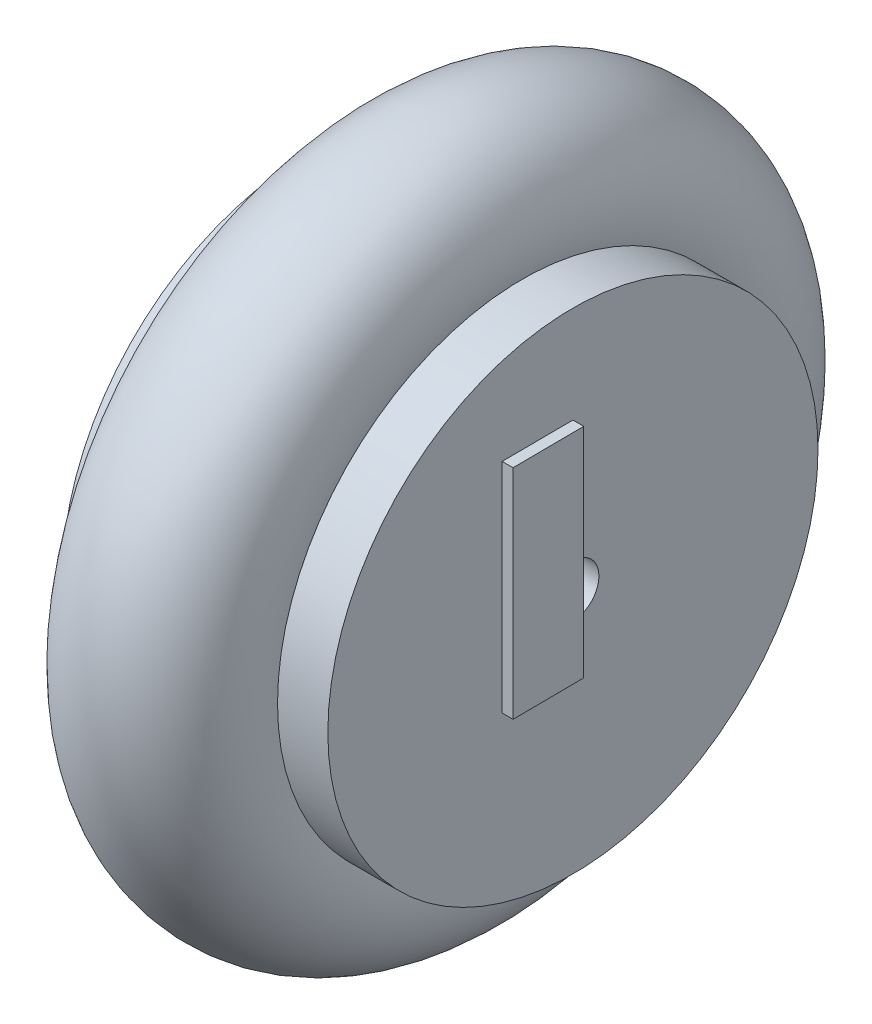
ISO-10303-21;
HEADER;
FILE_DESCRIPTION(('STEP AP214'),'2;1');
FILE_NAME('part.step','',(''),(''),'','','');
FILE_SCHEMA(('AUTOMOTIVE_DESIGN { 1 0 10303 214 1 1 1 1 }'));
ENDSEC;
DATA;
#1=APPLICATION_CONTEXT('core data for automotive mechanical design processes');
#2=APPLICATION_PROTOCOL_DEFINITION('international standard','automotive_design',2000,#1);
#3=PRODUCT_CONTEXT('',#1,'mechanical');
#4=PRODUCT('Part','Part','',(#3));
#5=PRODUCT_RELATED_PRODUCT_CATEGORY('part','',(#4));
#6=PRODUCT_DEFINITION_FORMATION('','',#4);
#7=PRODUCT_DEFINITION_CONTEXT('part definition',#1,'design');
#8=PRODUCT_DEFINITION('design','',#6,#7);
#9=PRODUCT_DEFINITION_SHAPE('','',#8);
#10=(LENGTH_UNIT() NAMED_UNIT(*) SI_UNIT(.MILLI.,.METRE.));
#11=(NAMED_UNIT(*) PLANE_ANGLE_UNIT() SI_UNIT($,.RADIAN.));
#12=(NAMED_UNIT(*) SI_UNIT($,.STERADIAN.) SOLID_ANGLE_UNIT());
#13=UNCERTAINTY_MEASURE_WITH_UNIT(LENGTH_MEASURE(1.E-05),#10,'distance_accuracy_value','');
#14=(GEOMETRIC_REPRESENTATION_CONTEXT(3) GLOBAL_UNCERTAINTY_ASSIGNED_CONTEXT((#13)) GLOBAL_UNIT_ASSIGNED_CONTEXT((#10,
#11,#12)) REPRESENTATION_CONTEXT('',''));
#15=CARTESIAN_POINT('',(0.,0.,0.));
#16=DIRECTION('',(0.,0.,1.));
#17=DIRECTION('',(1.,0.,0.));
#18=AXIS2_PLACEMENT_3D('',#15,#16,#17);
#19=CARTESIAN_POINT('',(0.,0.,0.));
#20=DIRECTION('',(1.,0.,0.));
#21=DIRECTION('',(0.,0.,-1.));
#22=AXIS2_PLACEMENT_3D('',#19,#20,#21);
#23=TOROIDAL_SURFACE('',#22,22.6899260605056,7.62);
#24=CARTESIAN_POINT('',(-7.44659608321137,0.,0.));
#25=DIRECTION('',(1.,0.,0.));
#26=DIRECTION('',(0.,0.,-1.));
#27=AXIS2_PLACEMENT_3D('',#24,#25,#26);
#28=CIRCLE('',#27,21.0735700435647);
#29=CARTESIAN_POINT('',(-7.44659608321137,0.,-21.0735700435647));
#30=VERTEX_POINT('',#29);
#31=EDGE_CURVE('E183',#30,#30,#28,.F.);
#32=ORIENTED_EDGE('',*,*,#31,.F.);
#33=CARTESIAN_POINT('',(0.,0.,-22.6899260605056));
#34=DIRECTION('',(0.,1.,0.));
#35=DIRECTION('',(0.,0.,1.));
#36=AXIS2_PLACEMENT_3D('',#33,#34,#35);
#37=CIRCLE('',#36,7.62);
#38=CARTESIAN_POINT('',(7.44659608321137,0.,-21.0735700435647));
#39=VERTEX_POINT('',#38);
#40=EDGE_CURVE('E181',#39,#30,#37,.T.);
#41=ORIENTED_EDGE('',*,*,#40,.F.);
#42=CARTESIAN_POINT('',(7.44659608321137,0.,0.));
#43=DIRECTION('',(-1.,0.,0.));
#44=DIRECTION('',(0.,0.,1.));
#45=AXIS2_PLACEMENT_3D('',#42,#43,#44);
#46=CIRCLE('',#45,21.0735700435647);
#47=EDGE_CURVE('E13',#39,#39,#46,.F.);
#48=ORIENTED_EDGE('',*,*,#47,.F.);
#49=ORIENTED_EDGE('',*,*,#40,.T.);
#50=EDGE_LOOP('',(#32,#41,#48,#49));
#51=FACE_BOUND('',#50,.T.);
#52=ADVANCED_FACE('F165',(#51),#23,.T.);
#53=CARTESIAN_POINT('',(-11.08752571471,2.23482823140527,0.));
#54=DIRECTION('',(1.,0.,0.));
#55=DIRECTION('',(0.,0.,-1.));
#56=AXIS2_PLACEMENT_3D('',#53,#54,#55);
#57=PLANE('',#56);
#58=CARTESIAN_POINT('',(-11.08752571471,0.,0.));
#59=DIRECTION('',(-1.,0.,0.));
#60=DIRECTION('',(0.,0.,1.));
#61=AXIS2_PLACEMENT_3D('',#58,#59,#60);
#62=CIRCLE('',#61,2.23482823140527);
#63=CARTESIAN_POINT('',(-11.08752571471,0.,2.23482823140527));
#64=VERTEX_POINT('',#63);
#65=EDGE_CURVE('E187',#64,#64,#62,.T.);
#66=ORIENTED_EDGE('',*,*,#65,.F.);
#67=EDGE_LOOP('',(#66));
#68=FACE_BOUND('',#67,.T.);
#69=CARTESIAN_POINT('',(-11.08752571471,0.,0.));
#70=DIRECTION('',(-1.,0.,0.));
#71=DIRECTION('',(0.,0.,1.));
#72=AXIS2_PLACEMENT_3D('',#69,#70,#71);
#73=CIRCLE('',#72,21.0735700435647);
#74=CARTESIAN_POINT('',(-11.08752571471,0.,21.0735700435647));
#75=VERTEX_POINT('',#74);
#76=EDGE_CURVE('E174',#75,#75,#73,.T.);
#77=ORIENTED_EDGE('',*,*,#76,.T.);
#78=EDGE_LOOP('',(#77));
#79=FACE_BOUND('',#78,.T.);
#80=ADVANCED_FACE('F167',(#68,#79),#57,.F.);
#81=CARTESIAN_POINT('',(-11.08752571471,0.,0.));
#82=DIRECTION('',(-1.,0.,0.));
#83=DIRECTION('',(0.,0.,1.));
#84=AXIS2_PLACEMENT_3D('',#81,#82,#83);
#85=CYLINDRICAL_SURFACE('',#84,21.0735700435647);
#86=ORIENTED_EDGE('',*,*,#31,.T.);
#87=EDGE_LOOP('',(#86));
#88=FACE_BOUND('',#87,.T.);
#89=ORIENTED_EDGE('',*,*,#76,.F.);
#90=EDGE_LOOP('',(#89));
#91=FACE_BOUND('',#90,.T.);
#92=ADVANCED_FACE('F205',(#88,#91),#85,.T.);
#93=CARTESIAN_POINT('',(-11.08752571471,0.,0.));
#94=DIRECTION('',(-1.,0.,0.));
#95=DIRECTION('',(0.,0.,1.));
#96=AXIS2_PLACEMENT_3D('',#93,#94,#95);
#97=CYLINDRICAL_SURFACE('',#96,21.0735700435647);
#98=ORIENTED_EDGE('',*,*,#47,.T.);
#99=EDGE_LOOP('',(#98));
#100=FACE_BOUND('',#99,.T.);
#101=CARTESIAN_POINT('',(11.77247428529,0.,0.));
#102=DIRECTION('',(-1.,0.,0.));
#103=DIRECTION('',(0.,0.,1.));
#104=AXIS2_PLACEMENT_3D('',#101,#102,#103);
#105=CIRCLE('',#104,21.0735700435647);
#106=CARTESIAN_POINT('',(11.77247428529,0.,21.0735700435647));
#107=VERTEX_POINT('',#106);
#108=EDGE_CURVE('E197',#107,#107,#105,.T.);
#109=ORIENTED_EDGE('',*,*,#108,.T.);
#110=EDGE_LOOP('',(#109));
#111=FACE_BOUND('',#110,.T.);
#112=ADVANCED_FACE('F207',(#100,#111),#97,.T.);
#113=CARTESIAN_POINT('',(11.77247428529,21.0735700435647,0.));
#114=DIRECTION('',(-1.,0.,0.));
#115=DIRECTION('',(0.,0.,1.));
#116=AXIS2_PLACEMENT_3D('',#113,#114,#115);
#117=PLANE('',#116);
#118=ORIENTED_EDGE('',*,*,#108,.F.);
#119=EDGE_LOOP('',(#118));
#120=FACE_BOUND('',#119,.T.);
#121=CARTESIAN_POINT('',(11.77247428529,0.,0.));
#122=DIRECTION('',(-1.,0.,0.));
#123=DIRECTION('',(0.,0.,1.));
#124=AXIS2_PLACEMENT_3D('',#121,#122,#123);
#125=CIRCLE('',#124,2.23482823140527);
#126=CARTESIAN_POINT('',(11.77247428529,0.,2.23482823140527));
#127=VERTEX_POINT('',#126);
#128=EDGE_CURVE('E193',#127,#127,#125,.T.);
#129=ORIENTED_EDGE('',*,*,#128,.T.);
#130=EDGE_LOOP('',(#129));
#131=FACE_BOUND('',#130,.T.);
#132=ADVANCED_FACE('F213',(#120,#131),#117,.F.);
#133=CARTESIAN_POINT('',(-11.08752571471,0.,0.));
#134=DIRECTION('',(-1.,0.,0.));
#135=DIRECTION('',(0.,0.,1.));
#136=AXIS2_PLACEMENT_3D('',#133,#134,#135);
#137=CYLINDRICAL_SURFACE('',#136,2.23482823140527);
#138=ORIENTED_EDGE('',*,*,#128,.F.);
#139=EDGE_LOOP('',(#138));
#140=FACE_BOUND('',#139,.T.);
#141=ORIENTED_EDGE('',*,*,#65,.T.);
#142=EDGE_LOOP('',(#141));
#143=FACE_BOUND('',#142,.T.);
#144=ADVANCED_FACE('F222',(#140,#143),#137,.F.);
#145=CLOSED_SHELL('',(#52,#80,#92,#112,#132,#144));
#146=MANIFOLD_SOLID_BREP('B2',#145);
#147=CARTESIAN_POINT('',(-10.16,12.1755766306336,0.));
#148=DIRECTION('',(-0.999997904582266,0.,0.00204715194287313));
#149=DIRECTION('',(0.,-1.,0.));
#150=AXIS2_PLACEMENT_3D('',#147,#148,#149);
#151=PLANE('',#150);
#152=DIRECTION('',(0.,-1.,0.));
#153=VECTOR('',#152,1.);
#154=CARTESIAN_POINT('',(-10.16,3.08513875554073,0.));
#155=LINE('',#154,#153);
#156=CARTESIAN_POINT('',(-10.16,12.1755766306336,0.));
#157=VERTEX_POINT('',#156);
#158=CARTESIAN_POINT('',(-10.16,-6.0052991195521,0.));
#159=VERTEX_POINT('',#158);
#160=EDGE_CURVE('E163',#157,#159,#155,.T.);
#161=ORIENTED_EDGE('',*,*,#160,.T.);
#162=DIRECTION('',(0.00204711777716626,-0.00577741186013735,0.999981215234069));
#163=VECTOR('',#162,1.);
#164=CARTESIAN_POINT('',(-10.1537727317824,-6.02287382563787,3.04191156429276));
#165=LINE('',#164,#163);
#166=CARTESIAN_POINT('',(-10.1475454635648,-6.04044853172365,6.08382312858548));
#167=VERTEX_POINT('',#166);
#168=EDGE_CURVE('E279',#159,#167,#165,.T.);
#169=ORIENTED_EDGE('',*,*,#168,.T.);
#170=DIRECTION('',(0.,-1.,0.));
#171=VECTOR('',#170,1.);
#172=CARTESIAN_POINT('',(-10.1475454635648,3.04998934336919,6.08382312858548));
#173=LINE('',#172,#171);
#174=CARTESIAN_POINT('',(-10.1475454635648,12.140427218462,6.08382312858548));
#175=VERTEX_POINT('',#174);
#176=EDGE_CURVE('E367',#175,#167,#173,.T.);
#177=ORIENTED_EDGE('',*,*,#176,.F.);
#178=DIRECTION('',(0.00204711777716996,-0.00577741186013746,0.999981215234069));
#179=VECTOR('',#178,1.);
#180=CARTESIAN_POINT('',(-10.1537727317824,12.1580019245478,3.04191156429274));
#181=LINE('',#180,#179);
#182=EDGE_CURVE('E364',#157,#175,#181,.T.);
#183=ORIENTED_EDGE('',*,*,#182,.F.);
#184=EDGE_LOOP('',(#161,#169,#177,#183));
#185=FACE_BOUND('',#184,.T.);
#186=ADVANCED_FACE('F269',(#185),#151,.T.);
#187=CARTESIAN_POINT('',(-10.16,-6.0052991195521,0.));
#188=DIRECTION('',(0.,-0.99998331054689,-0.0057774239658499));
#189=DIRECTION('',(1.,0.,0.));
#190=AXIS2_PLACEMENT_3D('',#187,#188,#189);
#191=PLANE('',#190);
#192=DIRECTION('',(1.,0.,0.));
#193=VECTOR('',#192,1.);
#194=CARTESIAN_POINT('',(1.27000000000001,-6.0052991195521,0.));
#195=LINE('',#194,#193);
#196=CARTESIAN_POINT('',(12.7,-6.0052991195521,0.));
#197=VERTEX_POINT('',#196);
#198=EDGE_CURVE('E288',#159,#197,#195,.T.);
#199=ORIENTED_EDGE('',*,*,#198,.T.);
#200=DIRECTION('',(0.0020471177771674,-0.00577741186013749,0.999981215234069));
#201=VECTOR('',#200,1.);
#202=CARTESIAN_POINT('',(12.7062272682176,-6.02287382563787,3.04191156429276));
#203=LINE('',#202,#201);
#204=CARTESIAN_POINT('',(12.7124545364352,-6.04044853172365,6.08382312858548));
#205=VERTEX_POINT('',#204);
#206=EDGE_CURVE('E406',#197,#205,#203,.T.);
#207=ORIENTED_EDGE('',*,*,#206,.T.);
#208=DIRECTION('',(1.,0.,0.));
#209=VECTOR('',#208,1.);
#210=CARTESIAN_POINT('',(1.28245453643522,-6.04044853172365,6.08382312858548));
#211=LINE('',#210,#209);
#212=EDGE_CURVE('E369',#167,#205,#211,.T.);
#213=ORIENTED_EDGE('',*,*,#212,.F.);
#214=ORIENTED_EDGE('',*,*,#168,.F.);
#215=EDGE_LOOP('',(#199,#207,#213,#214));
#216=FACE_BOUND('',#215,.T.);
#217=ADVANCED_FACE('F415',(#216),#191,.T.);
#218=CARTESIAN_POINT('',(12.7,-6.0052991195521,0.));
#219=DIRECTION('',(0.999997904582266,0.,-0.00204715194287058));
#220=DIRECTION('',(0.,1.,0.));
#221=AXIS2_PLACEMENT_3D('',#218,#219,#220);
#222=PLANE('',#221);
#223=DIRECTION('',(0.,1.,0.));
#224=VECTOR('',#223,1.);
#225=CARTESIAN_POINT('',(12.7,3.36254409544794,0.));
#226=LINE('',#225,#224);
#227=CARTESIAN_POINT('',(12.7,12.730387310448,0.));
#228=VERTEX_POINT('',#227);
#229=EDGE_CURVE('E411',#197,#228,#226,.T.);
#230=ORIENTED_EDGE('',*,*,#229,.T.);
#231=DIRECTION('',(0.00204711777716769,-0.00577741186013749,0.999981215234069));
#232=VECTOR('',#231,1.);
#233=CARTESIAN_POINT('',(12.7062272682176,12.7128126043622,3.04191156429272));
#234=LINE('',#233,#232);
#235=CARTESIAN_POINT('',(12.7124545364352,12.6952378982764,6.08382312858545));
#236=VERTEX_POINT('',#235);
#237=EDGE_CURVE('E390',#228,#236,#234,.T.);
#238=ORIENTED_EDGE('',*,*,#237,.T.);
#239=DIRECTION('',(0.,1.,0.));
#240=VECTOR('',#239,1.);
#241=CARTESIAN_POINT('',(12.7124545364352,3.32739468327639,6.08382312858546));
#242=LINE('',#241,#240);
#243=EDGE_CURVE('E372',#205,#236,#242,.T.);
#244=ORIENTED_EDGE('',*,*,#243,.F.);
#245=ORIENTED_EDGE('',*,*,#206,.F.);
#246=EDGE_LOOP('',(#230,#238,#244,#245));
#247=FACE_BOUND('',#246,.T.);
#248=ADVANCED_FACE('F413',(#247),#222,.T.);
#249=CARTESIAN_POINT('',(12.7,12.730387310448,0.));
#250=DIRECTION('',(0.,0.99998331054689,0.00577742396585004));
#251=DIRECTION('',(-1.,0.,0.));
#252=AXIS2_PLACEMENT_3D('',#249,#250,#251);
#253=PLANE('',#252);
#254=DIRECTION('',(-1.,0.,0.));
#255=VECTOR('',#254,1.);
#256=CARTESIAN_POINT('',(10.16,12.730387310448,0.));
#257=LINE('',#256,#255);
#258=CARTESIAN_POINT('',(7.62,12.730387310448,0.));
#259=VERTEX_POINT('',#258);
#260=EDGE_CURVE('E385',#228,#259,#257,.T.);
#261=ORIENTED_EDGE('',*,*,#260,.T.);
#262=DIRECTION('',(0.00204711777717581,-0.00577741186013777,0.999981215234069));
#263=VECTOR('',#262,1.);
#264=CARTESIAN_POINT('',(7.62622726821763,12.7128126043622,3.04191156429272));
#265=LINE('',#264,#263);
#266=CARTESIAN_POINT('',(7.63245453643527,12.6952378982764,6.08382312858545));
#267=VERTEX_POINT('',#266);
#268=EDGE_CURVE('E383',#259,#267,#265,.T.);
#269=ORIENTED_EDGE('',*,*,#268,.T.);
#270=DIRECTION('',(-1.,0.,0.));
#271=VECTOR('',#270,1.);
#272=CARTESIAN_POINT('',(10.1724545364352,12.6952378982764,6.08382312858545));
#273=LINE('',#272,#271);
#274=EDGE_CURVE('E375',#236,#267,#273,.T.);
#275=ORIENTED_EDGE('',*,*,#274,.F.);
#276=ORIENTED_EDGE('',*,*,#237,.F.);
#277=EDGE_LOOP('',(#261,#269,#275,#276));
#278=FACE_BOUND('',#277,.T.);
#279=ADVANCED_FACE('F384',(#278),#253,.T.);
#280=CARTESIAN_POINT('',(7.62,12.730387310448,0.));
#281=DIRECTION('',(-0.928774578929489,0.370623041224326,0.0040426288453619));
#282=DIRECTION('',(-0.370626069779458,-0.928782168433391,0.));
#283=AXIS2_PLACEMENT_3D('',#280,#281,#282);
#284=PLANE('',#283);
#285=DIRECTION('',(-0.370626069779458,-0.928782168433391,0.));
#286=VECTOR('',#285,1.);
#287=CARTESIAN_POINT('',(5.08,6.36519365522399,0.));
#288=LINE('',#287,#286);
#289=CARTESIAN_POINT('',(2.54,0.,0.));
#290=VERTEX_POINT('',#289);
#291=EDGE_CURVE('E388',#259,#290,#288,.T.);
#292=ORIENTED_EDGE('',*,*,#291,.T.);
#293=DIRECTION('',(0.00204711777717602,-0.00577741186013738,0.999981215234069));
#294=VECTOR('',#293,1.);
#295=CARTESIAN_POINT('',(2.54622726821764,-0.0175747060857741,3.04191156429278));
#296=LINE('',#295,#294);
#297=CARTESIAN_POINT('',(2.55245453643527,-0.0351494121715481,6.08382312858552));
#298=VERTEX_POINT('',#297);
#299=EDGE_CURVE('E355',#290,#298,#296,.T.);
#300=ORIENTED_EDGE('',*,*,#299,.T.);
#301=DIRECTION('',(-0.370626069779458,-0.928782168433391,0.));
#302=VECTOR('',#301,1.);
#303=CARTESIAN_POINT('',(5.09245453643527,6.33004424305244,6.08382312858548));
#304=LINE('',#303,#302);
#305=EDGE_CURVE('E345',#267,#298,#304,.T.);
#306=ORIENTED_EDGE('',*,*,#305,.F.);
#307=ORIENTED_EDGE('',*,*,#268,.F.);
#308=EDGE_LOOP('',(#292,#300,#306,#307));
#309=FACE_BOUND('',#308,.T.);
#310=ADVANCED_FACE('F394',(#309),#284,.T.);
#311=CARTESIAN_POINT('',(2.54,0.,0.));
#312=DIRECTION('',(0.,0.99998331054689,0.00577742396584993));
#313=DIRECTION('',(-1.,0.,0.));
#314=AXIS2_PLACEMENT_3D('',#311,#312,#313);
#315=PLANE('',#314);
#316=DIRECTION('',(-1.,0.,0.));
#317=VECTOR('',#316,1.);
#318=CARTESIAN_POINT('',(1.27,0.,0.));
#319=LINE('',#318,#317);
#320=CARTESIAN_POINT('',(0.,0.,0.));
#321=VERTEX_POINT('',#320);
#322=EDGE_CURVE('E352',#290,#321,#319,.T.);
#323=ORIENTED_EDGE('',*,*,#322,.T.);
#324=DIRECTION('',(0.00204711777716154,-0.00577741186013746,0.999981215234069));
#325=VECTOR('',#324,1.);
#326=CARTESIAN_POINT('',(0.00622726821759368,-0.017574706085776,3.04191156429278));
#327=LINE('',#326,#325);
#328=CARTESIAN_POINT('',(0.0124545364351865,-0.0351494121715503,6.08382312858552));
#329=VERTEX_POINT('',#328);
#330=EDGE_CURVE('E336',#321,#329,#327,.T.);
#331=ORIENTED_EDGE('',*,*,#330,.T.);
#332=DIRECTION('',(-1.,0.,0.));
#333=VECTOR('',#332,1.);
#334=CARTESIAN_POINT('',(1.28245453643523,-0.0351494121715487,6.08382312858552));
#335=LINE('',#334,#333);
#336=EDGE_CURVE('E340',#298,#329,#335,.T.);
#337=ORIENTED_EDGE('',*,*,#336,.F.);
#338=ORIENTED_EDGE('',*,*,#299,.F.);
#339=EDGE_LOOP('',(#323,#331,#337,#338));
#340=FACE_BOUND('',#339,.T.);
#341=ADVANCED_FACE('F351',(#340),#315,.T.);
#342=CARTESIAN_POINT('',(0.,0.,0.));
#343=DIRECTION('',(0.922892613039737,0.385057284469484,0.000335370947426351));
#344=DIRECTION('',(-0.385057306123889,0.922892664940303,0.));
#345=AXIS2_PLACEMENT_3D('',#342,#343,#344);
#346=PLANE('',#345);
#347=DIRECTION('',(-0.385057306123889,0.922892664940302,0.));
#348=VECTOR('',#347,1.);
#349=CARTESIAN_POINT('',(-2.54,6.08778831531679,0.));
#350=LINE('',#349,#348);
#351=CARTESIAN_POINT('',(-5.08000000000001,12.1755766306336,0.));
#352=VERTEX_POINT('',#351);
#353=EDGE_CURVE('E353',#321,#352,#350,.T.);
#354=ORIENTED_EDGE('',*,*,#353,.T.);
#355=DIRECTION('',(0.00204711777716154,-0.00577741186013746,0.999981215234069));
#356=VECTOR('',#355,1.);
#357=CARTESIAN_POINT('',(-5.07377273178242,12.1580019245478,3.04191156429274));
#358=LINE('',#357,#356);
#359=CARTESIAN_POINT('',(-5.06754546356482,12.140427218462,6.08382312858548));
#360=VERTEX_POINT('',#359);
#361=EDGE_CURVE('E338',#352,#360,#358,.T.);
#362=ORIENTED_EDGE('',*,*,#361,.T.);
#363=DIRECTION('',(-0.385057306123889,0.922892664940302,0.));
#364=VECTOR('',#363,1.);
#365=CARTESIAN_POINT('',(-2.52754546356482,6.05263890314524,6.0838231285855));
#366=LINE('',#365,#364);
#367=EDGE_CURVE('E331',#329,#360,#366,.T.);
#368=ORIENTED_EDGE('',*,*,#367,.F.);
#369=ORIENTED_EDGE('',*,*,#330,.F.);
#370=EDGE_LOOP('',(#354,#362,#368,#369));
#371=FACE_BOUND('',#370,.T.);
#372=ADVANCED_FACE('F334',(#371),#346,.T.);
#373=CARTESIAN_POINT('',(-5.08000000000001,12.1755766306336,0.));
#374=DIRECTION('',(0.,0.99998331054689,0.00577742396585001));
#375=DIRECTION('',(-1.,0.,0.));
#376=AXIS2_PLACEMENT_3D('',#373,#374,#375);
#377=PLANE('',#376);
#378=DIRECTION('',(-1.,0.,0.));
#379=VECTOR('',#378,1.);
#380=CARTESIAN_POINT('',(-7.62000000000001,12.1755766306336,0.));
#381=LINE('',#380,#379);
#382=EDGE_CURVE('E361',#352,#157,#381,.T.);
#383=ORIENTED_EDGE('',*,*,#382,.T.);
#384=ORIENTED_EDGE('',*,*,#182,.T.);
#385=DIRECTION('',(-1.,0.,0.));
#386=VECTOR('',#385,1.);
#387=CARTESIAN_POINT('',(-7.6075454635648,12.140427218462,6.08382312858548));
#388=LINE('',#387,#386);
#389=EDGE_CURVE('E273',#360,#175,#388,.T.);
#390=ORIENTED_EDGE('',*,*,#389,.F.);
#391=ORIENTED_EDGE('',*,*,#361,.F.);
#392=EDGE_LOOP('',(#383,#384,#390,#391));
#393=FACE_BOUND('',#392,.T.);
#394=ADVANCED_FACE('F271',(#393),#377,.T.);
#395=CARTESIAN_POINT('',(0.,0.,0.));
#396=DIRECTION('',(0.,0.,1.));
#397=DIRECTION('',(0.,-1.,0.));
#398=AXIS2_PLACEMENT_3D('',#395,#396,#397);
#399=PLANE('',#398);
#400=ORIENTED_EDGE('',*,*,#382,.F.);
#401=ORIENTED_EDGE('',*,*,#353,.F.);
#402=ORIENTED_EDGE('',*,*,#322,.F.);
#403=ORIENTED_EDGE('',*,*,#291,.F.);
#404=ORIENTED_EDGE('',*,*,#260,.F.);
#405=ORIENTED_EDGE('',*,*,#229,.F.);
#406=ORIENTED_EDGE('',*,*,#198,.F.);
#407=ORIENTED_EDGE('',*,*,#160,.F.);
#408=EDGE_LOOP('',(#400,#401,#402,#403,#404,#405,#406,#407));
#409=FACE_BOUND('',#408,.T.);
#410=ADVANCED_FACE('F395',(#409),#399,.F.);
#411=CARTESIAN_POINT('',(0.,0.,6.08382312858548));
#412=DIRECTION('',(0.,0.,1.));
#413=DIRECTION('',(1.,0.,0.));
#414=AXIS2_PLACEMENT_3D('',#411,#412,#413);
#415=PLANE('',#414);
#416=ORIENTED_EDGE('',*,*,#176,.T.);
#417=ORIENTED_EDGE('',*,*,#212,.T.);
#418=ORIENTED_EDGE('',*,*,#243,.T.);
#419=ORIENTED_EDGE('',*,*,#274,.T.);
#420=ORIENTED_EDGE('',*,*,#305,.T.);
#421=ORIENTED_EDGE('',*,*,#336,.T.);
#422=ORIENTED_EDGE('',*,*,#367,.T.);
#423=ORIENTED_EDGE('',*,*,#389,.T.);
#424=EDGE_LOOP('',(#416,#417,#418,#419,#420,#421,#422,#423));
#425=FACE_BOUND('',#424,.T.);
#426=ADVANCED_FACE('F343',(#425),#415,.T.);
#427=CLOSED_SHELL('',(#186,#217,#248,#279,#310,#341,#372,#394,#410,#426));
#428=MANIFOLD_SOLID_BREP('B7_NOT_SHOWN',#427);
#429=ADVANCED_BREP_SHAPE_REPRESENTATION('',(#18,#146,#428),#14);
#430=SHAPE_DEFINITION_REPRESENTATION(#9,#429);
ENDSEC;
END-ISO-10303-21;
